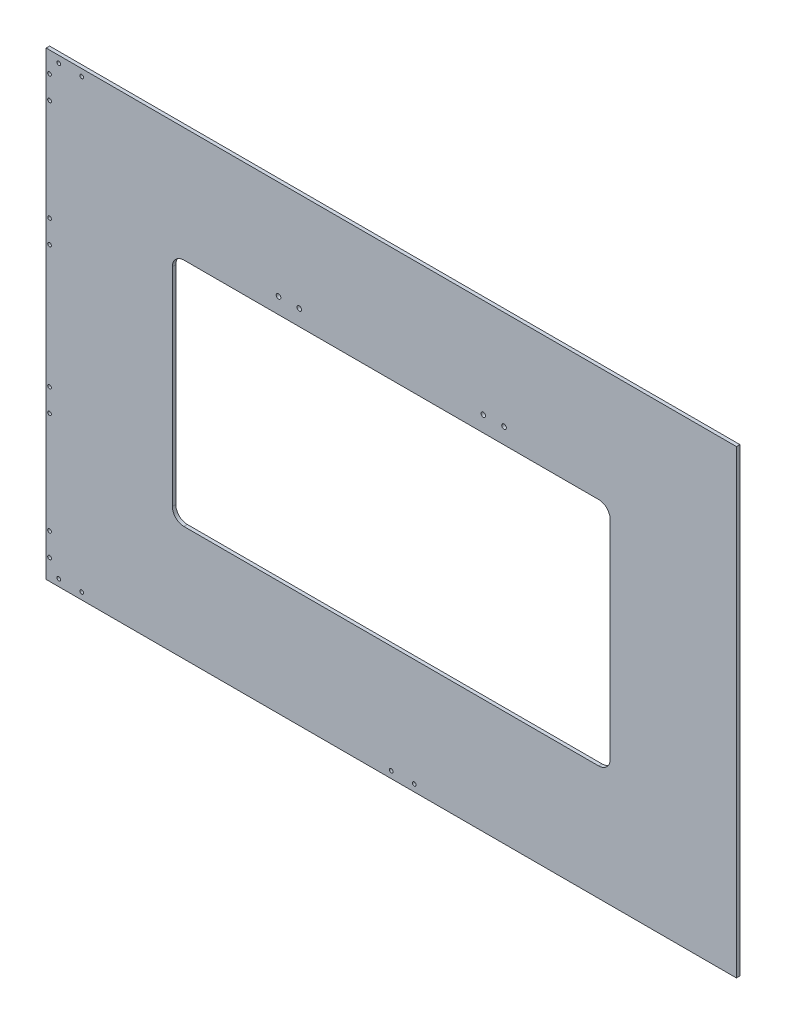
ISO-10303-21;
HEADER;
FILE_DESCRIPTION(('STEP AP214'),'2;1');
FILE_NAME('part.step','',(''),(''),'','','');
FILE_SCHEMA(('AUTOMOTIVE_DESIGN { 1 0 10303 214 1 1 1 1 }'));
ENDSEC;
DATA;
#1=APPLICATION_CONTEXT('core data for automotive mechanical design processes');
#2=APPLICATION_PROTOCOL_DEFINITION('international standard','automotive_design',2000,#1);
#3=PRODUCT_CONTEXT('',#1,'mechanical');
#4=PRODUCT('Part','Part','',(#3));
#5=PRODUCT_RELATED_PRODUCT_CATEGORY('part','',(#4));
#6=PRODUCT_DEFINITION_FORMATION('','',#4);
#7=PRODUCT_DEFINITION_CONTEXT('part definition',#1,'design');
#8=PRODUCT_DEFINITION('design','',#6,#7);
#9=PRODUCT_DEFINITION_SHAPE('','',#8);
#10=(LENGTH_UNIT() NAMED_UNIT(*) SI_UNIT(.MILLI.,.METRE.));
#11=(NAMED_UNIT(*) PLANE_ANGLE_UNIT() SI_UNIT($,.RADIAN.));
#12=(NAMED_UNIT(*) SI_UNIT($,.STERADIAN.) SOLID_ANGLE_UNIT());
#13=UNCERTAINTY_MEASURE_WITH_UNIT(LENGTH_MEASURE(1.E-05),#10,'distance_accuracy_value','');
#14=(GEOMETRIC_REPRESENTATION_CONTEXT(3) GLOBAL_UNCERTAINTY_ASSIGNED_CONTEXT((#13)) GLOBAL_UNIT_ASSIGNED_CONTEXT((#10,
#11,#12)) REPRESENTATION_CONTEXT('',''));
#15=CARTESIAN_POINT('',(0.,0.,0.));
#16=DIRECTION('',(0.,0.,1.));
#17=DIRECTION('',(1.,0.,0.));
#18=AXIS2_PLACEMENT_3D('',#15,#16,#17);
#19=CARTESIAN_POINT('',(300.,200.,3.));
#20=DIRECTION('',(-1.,0.,0.));
#21=DIRECTION('',(0.,0.,1.));
#22=AXIS2_PLACEMENT_3D('',#19,#20,#21);
#23=PLANE('',#22);
#24=DIRECTION('',(0.,1.,0.));
#25=VECTOR('',#24,1.);
#26=CARTESIAN_POINT('',(300.,200.,0.));
#27=LINE('',#26,#25);
#28=CARTESIAN_POINT('',(300.,-200.,0.));
#29=VERTEX_POINT('',#28);
#30=CARTESIAN_POINT('',(300.,200.,0.));
#31=VERTEX_POINT('',#30);
#32=EDGE_CURVE('E152',#29,#31,#27,.T.);
#33=ORIENTED_EDGE('',*,*,#32,.T.);
#34=DIRECTION('',(0.,0.,-1.));
#35=VECTOR('',#34,1.);
#36=CARTESIAN_POINT('',(300.,200.,3.));
#37=LINE('',#36,#35);
#38=CARTESIAN_POINT('',(300.,200.,3.));
#39=VERTEX_POINT('',#38);
#40=EDGE_CURVE('E134',#39,#31,#37,.T.);
#41=ORIENTED_EDGE('',*,*,#40,.F.);
#42=DIRECTION('',(0.,1.,0.));
#43=VECTOR('',#42,1.);
#44=CARTESIAN_POINT('',(300.,200.,3.));
#45=LINE('',#44,#43);
#46=CARTESIAN_POINT('',(300.,-200.,3.));
#47=VERTEX_POINT('',#46);
#48=EDGE_CURVE('E145',#47,#39,#45,.T.);
#49=ORIENTED_EDGE('',*,*,#48,.F.);
#50=DIRECTION('',(0.,0.,-1.));
#51=VECTOR('',#50,1.);
#52=CARTESIAN_POINT('',(300.,-200.,3.));
#53=LINE('',#52,#51);
#54=EDGE_CURVE('E293',#47,#29,#53,.T.);
#55=ORIENTED_EDGE('',*,*,#54,.T.);
#56=EDGE_LOOP('',(#33,#41,#49,#55));
#57=FACE_BOUND('',#56,.T.);
#58=ADVANCED_FACE('F41',(#57),#23,.F.);
#59=CARTESIAN_POINT('',(-300.,200.,3.));
#60=DIRECTION('',(0.,-1.,0.));
#61=DIRECTION('',(0.,0.,-1.));
#62=AXIS2_PLACEMENT_3D('',#59,#60,#61);
#63=PLANE('',#62);
#64=DIRECTION('',(-1.,0.,0.));
#65=VECTOR('',#64,1.);
#66=CARTESIAN_POINT('',(-300.,200.,0.));
#67=LINE('',#66,#65);
#68=CARTESIAN_POINT('',(-300.,200.,0.));
#69=VERTEX_POINT('',#68);
#70=EDGE_CURVE('E291',#31,#69,#67,.T.);
#71=ORIENTED_EDGE('',*,*,#70,.T.);
#72=DIRECTION('',(0.,0.,-1.));
#73=VECTOR('',#72,1.);
#74=CARTESIAN_POINT('',(-300.,200.,3.));
#75=LINE('',#74,#73);
#76=CARTESIAN_POINT('',(-300.,200.,3.));
#77=VERTEX_POINT('',#76);
#78=EDGE_CURVE('E139',#77,#69,#75,.T.);
#79=ORIENTED_EDGE('',*,*,#78,.F.);
#80=DIRECTION('',(-1.,0.,0.));
#81=VECTOR('',#80,1.);
#82=CARTESIAN_POINT('',(-300.,200.,3.));
#83=LINE('',#82,#81);
#84=EDGE_CURVE('E131',#39,#77,#83,.T.);
#85=ORIENTED_EDGE('',*,*,#84,.F.);
#86=ORIENTED_EDGE('',*,*,#40,.T.);
#87=EDGE_LOOP('',(#71,#79,#85,#86));
#88=FACE_BOUND('',#87,.T.);
#89=ADVANCED_FACE('F133',(#88),#63,.F.);
#90=CARTESIAN_POINT('',(-300.,200.,3.));
#91=DIRECTION('',(1.,0.,0.));
#92=DIRECTION('',(0.,0.,-1.));
#93=AXIS2_PLACEMENT_3D('',#90,#91,#92);
#94=PLANE('',#93);
#95=DIRECTION('',(0.,-1.,0.));
#96=VECTOR('',#95,1.);
#97=CARTESIAN_POINT('',(-300.,200.,0.));
#98=LINE('',#97,#96);
#99=CARTESIAN_POINT('',(-300.,-200.,0.));
#100=VERTEX_POINT('',#99);
#101=EDGE_CURVE('E294',#69,#100,#98,.T.);
#102=ORIENTED_EDGE('',*,*,#101,.T.);
#103=DIRECTION('',(0.,0.,-1.));
#104=VECTOR('',#103,1.);
#105=CARTESIAN_POINT('',(-300.,-200.,3.));
#106=LINE('',#105,#104);
#107=CARTESIAN_POINT('',(-300.,-200.,3.));
#108=VERTEX_POINT('',#107);
#109=EDGE_CURVE('E156',#108,#100,#106,.T.);
#110=ORIENTED_EDGE('',*,*,#109,.F.);
#111=DIRECTION('',(0.,-1.,0.));
#112=VECTOR('',#111,1.);
#113=CARTESIAN_POINT('',(-300.,200.,3.));
#114=LINE('',#113,#112);
#115=EDGE_CURVE('E142',#77,#108,#114,.T.);
#116=ORIENTED_EDGE('',*,*,#115,.F.);
#117=ORIENTED_EDGE('',*,*,#78,.T.);
#118=EDGE_LOOP('',(#102,#110,#116,#117));
#119=FACE_BOUND('',#118,.T.);
#120=ADVANCED_FACE('F306',(#119),#94,.F.);
#121=CARTESIAN_POINT('',(-300.,-200.,3.));
#122=DIRECTION('',(0.,1.,0.));
#123=DIRECTION('',(0.,0.,1.));
#124=AXIS2_PLACEMENT_3D('',#121,#122,#123);
#125=PLANE('',#124);
#126=DIRECTION('',(1.,0.,0.));
#127=VECTOR('',#126,1.);
#128=CARTESIAN_POINT('',(-300.,-200.,0.));
#129=LINE('',#128,#127);
#130=EDGE_CURVE('E151',#100,#29,#129,.T.);
#131=ORIENTED_EDGE('',*,*,#130,.T.);
#132=ORIENTED_EDGE('',*,*,#54,.F.);
#133=DIRECTION('',(1.,0.,0.));
#134=VECTOR('',#133,1.);
#135=CARTESIAN_POINT('',(-300.,-200.,3.));
#136=LINE('',#135,#134);
#137=EDGE_CURVE('E150',#108,#47,#136,.T.);
#138=ORIENTED_EDGE('',*,*,#137,.F.);
#139=ORIENTED_EDGE('',*,*,#109,.T.);
#140=EDGE_LOOP('',(#131,#132,#138,#139));
#141=FACE_BOUND('',#140,.T.);
#142=ADVANCED_FACE('F305',(#141),#125,.F.);
#143=CARTESIAN_POINT('',(0.,0.,3.));
#144=DIRECTION('',(0.,0.,1.));
#145=DIRECTION('',(1.,0.,0.));
#146=AXIS2_PLACEMENT_3D('',#143,#144,#145);
#147=PLANE('',#146);
#148=CARTESIAN_POINT('',(-98.0000000000002,114.,3.));
#149=DIRECTION('',(0.,0.,1.));
#150=DIRECTION('',(1.,0.,0.));
#151=AXIS2_PLACEMENT_3D('',#148,#149,#150);
#152=CIRCLE('',#151,1.99999999999998);
#153=CARTESIAN_POINT('',(-96.0000000000002,114.,3.));
#154=VERTEX_POINT('',#153);
#155=EDGE_CURVE('E441',#154,#154,#152,.T.);
#156=ORIENTED_EDGE('',*,*,#155,.F.);
#157=EDGE_LOOP('',(#156));
#158=FACE_BOUND('',#157,.T.);
#159=CARTESIAN_POINT('',(-80.0000000000002,114.,3.));
#160=DIRECTION('',(0.,0.,1.));
#161=DIRECTION('',(1.,0.,0.));
#162=AXIS2_PLACEMENT_3D('',#159,#160,#161);
#163=CIRCLE('',#162,2.00000000000001);
#164=CARTESIAN_POINT('',(-78.0000000000002,114.,3.));
#165=VERTEX_POINT('',#164);
#166=EDGE_CURVE('E463',#165,#165,#163,.T.);
#167=ORIENTED_EDGE('',*,*,#166,.F.);
#168=EDGE_LOOP('',(#167));
#169=FACE_BOUND('',#168,.T.);
#170=CARTESIAN_POINT('',(80.0000000000002,114.,3.));
#171=DIRECTION('',(0.,0.,1.));
#172=DIRECTION('',(-1.,0.,0.));
#173=AXIS2_PLACEMENT_3D('',#170,#171,#172);
#174=CIRCLE('',#173,2.00000000000001);
#175=CARTESIAN_POINT('',(78.0000000000002,114.,3.));
#176=VERTEX_POINT('',#175);
#177=EDGE_CURVE('E462',#176,#176,#174,.T.);
#178=ORIENTED_EDGE('',*,*,#177,.F.);
#179=EDGE_LOOP('',(#178));
#180=FACE_BOUND('',#179,.T.);
#181=CARTESIAN_POINT('',(98.0000000000002,114.,3.));
#182=DIRECTION('',(0.,0.,1.));
#183=DIRECTION('',(-1.,0.,0.));
#184=AXIS2_PLACEMENT_3D('',#181,#182,#183);
#185=CIRCLE('',#184,1.99999999999998);
#186=CARTESIAN_POINT('',(96.0000000000002,114.,3.));
#187=VERTEX_POINT('',#186);
#188=EDGE_CURVE('E460',#187,#187,#185,.T.);
#189=ORIENTED_EDGE('',*,*,#188,.F.);
#190=EDGE_LOOP('',(#189));
#191=FACE_BOUND('',#190,.T.);
#192=CARTESIAN_POINT('',(-297.,73.5000000000003,3.));
#193=DIRECTION('',(0.,0.,1.));
#194=DIRECTION('',(1.,0.,0.));
#195=AXIS2_PLACEMENT_3D('',#192,#193,#194);
#196=CIRCLE('',#195,1.57500000000017);
#197=CARTESIAN_POINT('',(-295.425,73.5000000000003,3.));
#198=VERTEX_POINT('',#197);
#199=EDGE_CURVE('E455',#198,#198,#196,.T.);
#200=ORIENTED_EDGE('',*,*,#199,.F.);
#201=EDGE_LOOP('',(#200));
#202=FACE_BOUND('',#201,.T.);
#203=CARTESIAN_POINT('',(-297.,53.5000000000003,3.));
#204=DIRECTION('',(0.,0.,1.));
#205=DIRECTION('',(1.,0.,0.));
#206=AXIS2_PLACEMENT_3D('',#203,#204,#205);
#207=CIRCLE('',#206,1.57500000000017);
#208=CARTESIAN_POINT('',(-295.425,53.5000000000003,3.));
#209=VERTEX_POINT('',#208);
#210=EDGE_CURVE('E446',#209,#209,#207,.T.);
#211=ORIENTED_EDGE('',*,*,#210,.F.);
#212=EDGE_LOOP('',(#211));
#213=FACE_BOUND('',#212,.T.);
#214=CARTESIAN_POINT('',(-297.,-53.5000000000005,3.));
#215=DIRECTION('',(0.,0.,1.));
#216=DIRECTION('',(1.,0.,0.));
#217=AXIS2_PLACEMENT_3D('',#214,#215,#216);
#218=CIRCLE('',#217,1.5750000000006);
#219=CARTESIAN_POINT('',(-295.424999999999,-53.5000000000005,3.));
#220=VERTEX_POINT('',#219);
#221=EDGE_CURVE('E444',#220,#220,#218,.T.);
#222=ORIENTED_EDGE('',*,*,#221,.F.);
#223=EDGE_LOOP('',(#222));
#224=FACE_BOUND('',#223,.T.);
#225=CARTESIAN_POINT('',(-297.,-73.5000000000006,3.));
#226=DIRECTION('',(0.,0.,1.));
#227=DIRECTION('',(1.,0.,0.));
#228=AXIS2_PLACEMENT_3D('',#225,#226,#227);
#229=CIRCLE('',#228,1.5750000000006);
#230=CARTESIAN_POINT('',(-295.424999999999,-73.5000000000006,3.));
#231=VERTEX_POINT('',#230);
#232=EDGE_CURVE('E438',#231,#231,#229,.T.);
#233=ORIENTED_EDGE('',*,*,#232,.F.);
#234=EDGE_LOOP('',(#233));
#235=FACE_BOUND('',#234,.T.);
#236=DIRECTION('',(0.,1.,0.));
#237=VECTOR('',#236,1.);
#238=CARTESIAN_POINT('',(190.25,100.25,3.));
#239=LINE('',#238,#237);
#240=CARTESIAN_POINT('',(190.25,-90.2499999999999,3.));
#241=VERTEX_POINT('',#240);
#242=CARTESIAN_POINT('',(190.25,90.25,3.));
#243=VERTEX_POINT('',#242);
#244=EDGE_CURVE('E192',#241,#243,#239,.T.);
#245=ORIENTED_EDGE('',*,*,#244,.F.);
#246=CARTESIAN_POINT('',(180.25,-90.25,3.));
#247=DIRECTION('',(0.,0.,1.));
#248=DIRECTION('',(1.,0.,0.));
#249=AXIS2_PLACEMENT_3D('',#246,#247,#248);
#250=CIRCLE('',#249,10.);
#251=CARTESIAN_POINT('',(180.25,-100.25,3.));
#252=VERTEX_POINT('',#251);
#253=EDGE_CURVE('E190',#241,#252,#250,.F.);
#254=ORIENTED_EDGE('',*,*,#253,.T.);
#255=DIRECTION('',(1.,0.,0.));
#256=VECTOR('',#255,1.);
#257=CARTESIAN_POINT('',(-190.25,-100.25,3.));
#258=LINE('',#257,#256);
#259=CARTESIAN_POINT('',(-180.25,-100.25,3.));
#260=VERTEX_POINT('',#259);
#261=EDGE_CURVE('E218',#260,#252,#258,.T.);
#262=ORIENTED_EDGE('',*,*,#261,.F.);
#263=CARTESIAN_POINT('',(-180.25,-90.25,3.));
#264=DIRECTION('',(0.,0.,1.));
#265=DIRECTION('',(1.,0.,0.));
#266=AXIS2_PLACEMENT_3D('',#263,#264,#265);
#267=CIRCLE('',#266,10.);
#268=CARTESIAN_POINT('',(-190.25,-90.2499999999999,3.));
#269=VERTEX_POINT('',#268);
#270=EDGE_CURVE('E177',#260,#269,#267,.F.);
#271=ORIENTED_EDGE('',*,*,#270,.T.);
#272=DIRECTION('',(0.,-1.,0.));
#273=VECTOR('',#272,1.);
#274=CARTESIAN_POINT('',(-190.25,100.25,3.));
#275=LINE('',#274,#273);
#276=CARTESIAN_POINT('',(-190.25,90.25,3.));
#277=VERTEX_POINT('',#276);
#278=EDGE_CURVE('E223',#277,#269,#275,.T.);
#279=ORIENTED_EDGE('',*,*,#278,.F.);
#280=CARTESIAN_POINT('',(-180.25,90.25,3.));
#281=DIRECTION('',(0.,0.,1.));
#282=DIRECTION('',(1.,0.,0.));
#283=AXIS2_PLACEMENT_3D('',#280,#281,#282);
#284=CIRCLE('',#283,10.);
#285=CARTESIAN_POINT('',(-180.25,100.25,3.));
#286=VERTEX_POINT('',#285);
#287=EDGE_CURVE('E182',#277,#286,#284,.F.);
#288=ORIENTED_EDGE('',*,*,#287,.T.);
#289=DIRECTION('',(-1.,0.,0.));
#290=VECTOR('',#289,1.);
#291=CARTESIAN_POINT('',(-190.25,100.25,3.));
#292=LINE('',#291,#290);
#293=CARTESIAN_POINT('',(180.25,100.25,3.));
#294=VERTEX_POINT('',#293);
#295=EDGE_CURVE('E194',#294,#286,#292,.T.);
#296=ORIENTED_EDGE('',*,*,#295,.F.);
#297=CARTESIAN_POINT('',(180.25,90.25,3.));
#298=DIRECTION('',(0.,0.,1.));
#299=DIRECTION('',(1.,0.,0.));
#300=AXIS2_PLACEMENT_3D('',#297,#298,#299);
#301=CIRCLE('',#300,10.);
#302=EDGE_CURVE('E47',#294,#243,#301,.F.);
#303=ORIENTED_EDGE('',*,*,#302,.T.);
#304=EDGE_LOOP('',(#245,#254,#262,#271,#279,#288,#296,#303));
#305=FACE_BOUND('',#304,.T.);
#306=CARTESIAN_POINT('',(0.,-194.,3.));
#307=DIRECTION('',(0.,0.,-1.));
#308=DIRECTION('',(-1.,0.,0.));
#309=AXIS2_PLACEMENT_3D('',#306,#307,#308);
#310=CIRCLE('',#309,1.59999999999999);
#311=CARTESIAN_POINT('',(-1.59999999999996,-194.,3.));
#312=VERTEX_POINT('',#311);
#313=EDGE_CURVE('E229',#312,#312,#310,.T.);
#314=ORIENTED_EDGE('',*,*,#313,.T.);
#315=EDGE_LOOP('',(#314));
#316=FACE_BOUND('',#315,.T.);
#317=CARTESIAN_POINT('',(20.,-194.,3.));
#318=DIRECTION('',(0.,0.,-1.));
#319=DIRECTION('',(-1.,0.,0.));
#320=AXIS2_PLACEMENT_3D('',#317,#318,#319);
#321=CIRCLE('',#320,1.59999999999999);
#322=CARTESIAN_POINT('',(18.4,-194.,3.));
#323=VERTEX_POINT('',#322);
#324=EDGE_CURVE('E225',#323,#323,#321,.T.);
#325=ORIENTED_EDGE('',*,*,#324,.T.);
#326=EDGE_LOOP('',(#325));
#327=FACE_BOUND('',#326,.T.);
#328=CARTESIAN_POINT('',(-297.,-162.,3.));
#329=DIRECTION('',(0.,0.,1.));
#330=DIRECTION('',(1.,0.,0.));
#331=AXIS2_PLACEMENT_3D('',#328,#329,#330);
#332=CIRCLE('',#331,1.59999999999996);
#333=CARTESIAN_POINT('',(-295.4,-162.,3.));
#334=VERTEX_POINT('',#333);
#335=EDGE_CURVE('E246',#334,#334,#332,.T.);
#336=ORIENTED_EDGE('',*,*,#335,.F.);
#337=EDGE_LOOP('',(#336));
#338=FACE_BOUND('',#337,.T.);
#339=CARTESIAN_POINT('',(-297.,-182.,3.));
#340=DIRECTION('',(0.,0.,1.));
#341=DIRECTION('',(1.,0.,0.));
#342=AXIS2_PLACEMENT_3D('',#339,#340,#341);
#343=CIRCLE('',#342,1.59999999999996);
#344=CARTESIAN_POINT('',(-295.4,-182.,3.));
#345=VERTEX_POINT('',#344);
#346=EDGE_CURVE('E248',#345,#345,#343,.T.);
#347=ORIENTED_EDGE('',*,*,#346,.F.);
#348=EDGE_LOOP('',(#347));
#349=FACE_BOUND('',#348,.T.);
#350=CARTESIAN_POINT('',(-289.,-194.,3.));
#351=DIRECTION('',(0.,0.,1.));
#352=DIRECTION('',(1.,0.,0.));
#353=AXIS2_PLACEMENT_3D('',#350,#351,#352);
#354=CIRCLE('',#353,1.59999999999996);
#355=CARTESIAN_POINT('',(-287.4,-194.,3.));
#356=VERTEX_POINT('',#355);
#357=EDGE_CURVE('E253',#356,#356,#354,.T.);
#358=ORIENTED_EDGE('',*,*,#357,.F.);
#359=EDGE_LOOP('',(#358));
#360=FACE_BOUND('',#359,.T.);
#361=CARTESIAN_POINT('',(-269.,-194.,3.));
#362=DIRECTION('',(0.,0.,1.));
#363=DIRECTION('',(1.,0.,0.));
#364=AXIS2_PLACEMENT_3D('',#361,#362,#363);
#365=CIRCLE('',#364,1.59999999999996);
#366=CARTESIAN_POINT('',(-267.4,-194.,3.));
#367=VERTEX_POINT('',#366);
#368=EDGE_CURVE('E261',#367,#367,#365,.T.);
#369=ORIENTED_EDGE('',*,*,#368,.F.);
#370=EDGE_LOOP('',(#369));
#371=FACE_BOUND('',#370,.T.);
#372=CARTESIAN_POINT('',(-297.,162.000000000001,3.));
#373=DIRECTION('',(0.,0.,1.));
#374=DIRECTION('',(1.,0.,0.));
#375=AXIS2_PLACEMENT_3D('',#372,#373,#374);
#376=CIRCLE('',#375,1.59999999999996);
#377=CARTESIAN_POINT('',(-295.4,162.000000000001,3.));
#378=VERTEX_POINT('',#377);
#379=EDGE_CURVE('E266',#378,#378,#376,.T.);
#380=ORIENTED_EDGE('',*,*,#379,.F.);
#381=EDGE_LOOP('',(#380));
#382=FACE_BOUND('',#381,.T.);
#383=CARTESIAN_POINT('',(-297.,182.000000000001,3.));
#384=DIRECTION('',(0.,0.,1.));
#385=DIRECTION('',(1.,0.,0.));
#386=AXIS2_PLACEMENT_3D('',#383,#384,#385);
#387=CIRCLE('',#386,1.59999999999996);
#388=CARTESIAN_POINT('',(-295.4,182.000000000001,3.));
#389=VERTEX_POINT('',#388);
#390=EDGE_CURVE('E275',#389,#389,#387,.T.);
#391=ORIENTED_EDGE('',*,*,#390,.F.);
#392=EDGE_LOOP('',(#391));
#393=FACE_BOUND('',#392,.T.);
#394=CARTESIAN_POINT('',(-289.,194.000000000001,3.));
#395=DIRECTION('',(0.,0.,1.));
#396=DIRECTION('',(1.,0.,0.));
#397=AXIS2_PLACEMENT_3D('',#394,#395,#396);
#398=CIRCLE('',#397,1.59999999999996);
#399=CARTESIAN_POINT('',(-287.4,194.000000000001,3.));
#400=VERTEX_POINT('',#399);
#401=EDGE_CURVE('E277',#400,#400,#398,.T.);
#402=ORIENTED_EDGE('',*,*,#401,.F.);
#403=EDGE_LOOP('',(#402));
#404=FACE_BOUND('',#403,.T.);
#405=CARTESIAN_POINT('',(-269.,194.000000000001,3.));
#406=DIRECTION('',(0.,0.,1.));
#407=DIRECTION('',(1.,0.,0.));
#408=AXIS2_PLACEMENT_3D('',#405,#406,#407);
#409=CIRCLE('',#408,1.59999999999996);
#410=CARTESIAN_POINT('',(-267.4,194.000000000001,3.));
#411=VERTEX_POINT('',#410);
#412=EDGE_CURVE('E282',#411,#411,#409,.T.);
#413=ORIENTED_EDGE('',*,*,#412,.F.);
#414=EDGE_LOOP('',(#413));
#415=FACE_BOUND('',#414,.T.);
#416=ORIENTED_EDGE('',*,*,#48,.T.);
#417=ORIENTED_EDGE('',*,*,#84,.T.);
#418=ORIENTED_EDGE('',*,*,#115,.T.);
#419=ORIENTED_EDGE('',*,*,#137,.T.);
#420=EDGE_LOOP('',(#416,#417,#418,#419));
#421=FACE_BOUND('',#420,.T.);
#422=ADVANCED_FACE('F143',(#158,#169,#180,#191,#202,#213,#224,#235,#305,#316,#327,#338,#349,
#360,#371,#382,#393,#404,#415,#421),#147,.T.);
#423=CARTESIAN_POINT('',(0.,0.,0.));
#424=DIRECTION('',(0.,0.,1.));
#425=DIRECTION('',(1.,0.,0.));
#426=AXIS2_PLACEMENT_3D('',#423,#424,#425);
#427=PLANE('',#426);
#428=CARTESIAN_POINT('',(-98.0000000000002,114.,0.));
#429=DIRECTION('',(0.,0.,1.));
#430=DIRECTION('',(1.,0.,0.));
#431=AXIS2_PLACEMENT_3D('',#428,#429,#430);
#432=CIRCLE('',#431,1.99999999999998);
#433=CARTESIAN_POINT('',(-96.0000000000002,114.,0.));
#434=VERTEX_POINT('',#433);
#435=EDGE_CURVE('E409',#434,#434,#432,.T.);
#436=ORIENTED_EDGE('',*,*,#435,.T.);
#437=EDGE_LOOP('',(#436));
#438=FACE_BOUND('',#437,.T.);
#439=CARTESIAN_POINT('',(-80.0000000000002,114.,0.));
#440=DIRECTION('',(0.,0.,1.));
#441=DIRECTION('',(1.,0.,0.));
#442=AXIS2_PLACEMENT_3D('',#439,#440,#441);
#443=CIRCLE('',#442,2.00000000000001);
#444=CARTESIAN_POINT('',(-78.0000000000002,114.,0.));
#445=VERTEX_POINT('',#444);
#446=EDGE_CURVE('E412',#445,#445,#443,.T.);
#447=ORIENTED_EDGE('',*,*,#446,.T.);
#448=EDGE_LOOP('',(#447));
#449=FACE_BOUND('',#448,.T.);
#450=CARTESIAN_POINT('',(80.0000000000002,114.,0.));
#451=DIRECTION('',(0.,0.,1.));
#452=DIRECTION('',(-1.,0.,0.));
#453=AXIS2_PLACEMENT_3D('',#450,#451,#452);
#454=CIRCLE('',#453,2.00000000000001);
#455=CARTESIAN_POINT('',(78.0000000000002,114.,0.));
#456=VERTEX_POINT('',#455);
#457=EDGE_CURVE('E419',#456,#456,#454,.T.);
#458=ORIENTED_EDGE('',*,*,#457,.T.);
#459=EDGE_LOOP('',(#458));
#460=FACE_BOUND('',#459,.T.);
#461=CARTESIAN_POINT('',(98.0000000000002,114.,0.));
#462=DIRECTION('',(0.,0.,1.));
#463=DIRECTION('',(-1.,0.,0.));
#464=AXIS2_PLACEMENT_3D('',#461,#462,#463);
#465=CIRCLE('',#464,1.99999999999998);
#466=CARTESIAN_POINT('',(96.0000000000002,114.,0.));
#467=VERTEX_POINT('',#466);
#468=EDGE_CURVE('E422',#467,#467,#465,.T.);
#469=ORIENTED_EDGE('',*,*,#468,.T.);
#470=EDGE_LOOP('',(#469));
#471=FACE_BOUND('',#470,.T.);
#472=CARTESIAN_POINT('',(-297.,73.5000000000003,0.));
#473=DIRECTION('',(0.,0.,1.));
#474=DIRECTION('',(1.,0.,0.));
#475=AXIS2_PLACEMENT_3D('',#472,#473,#474);
#476=CIRCLE('',#475,1.57500000000017);
#477=CARTESIAN_POINT('',(-295.425,73.5000000000003,0.));
#478=VERTEX_POINT('',#477);
#479=EDGE_CURVE('E199',#478,#478,#476,.T.);
#480=ORIENTED_EDGE('',*,*,#479,.T.);
#481=EDGE_LOOP('',(#480));
#482=FACE_BOUND('',#481,.T.);
#483=CARTESIAN_POINT('',(-297.,53.5000000000003,0.));
#484=DIRECTION('',(0.,0.,1.));
#485=DIRECTION('',(1.,0.,0.));
#486=AXIS2_PLACEMENT_3D('',#483,#484,#485);
#487=CIRCLE('',#486,1.57500000000017);
#488=CARTESIAN_POINT('',(-295.425,53.5000000000003,0.));
#489=VERTEX_POINT('',#488);
#490=EDGE_CURVE('E429',#489,#489,#487,.T.);
#491=ORIENTED_EDGE('',*,*,#490,.T.);
#492=EDGE_LOOP('',(#491));
#493=FACE_BOUND('',#492,.T.);
#494=CARTESIAN_POINT('',(-297.,-53.5000000000005,0.));
#495=DIRECTION('',(0.,0.,1.));
#496=DIRECTION('',(1.,0.,0.));
#497=AXIS2_PLACEMENT_3D('',#494,#495,#496);
#498=CIRCLE('',#497,1.5750000000006);
#499=CARTESIAN_POINT('',(-295.424999999999,-53.5000000000005,0.));
#500=VERTEX_POINT('',#499);
#501=EDGE_CURVE('E433',#500,#500,#498,.T.);
#502=ORIENTED_EDGE('',*,*,#501,.T.);
#503=EDGE_LOOP('',(#502));
#504=FACE_BOUND('',#503,.T.);
#505=CARTESIAN_POINT('',(-297.,-73.5000000000006,0.));
#506=DIRECTION('',(0.,0.,1.));
#507=DIRECTION('',(1.,0.,0.));
#508=AXIS2_PLACEMENT_3D('',#505,#506,#507);
#509=CIRCLE('',#508,1.5750000000006);
#510=CARTESIAN_POINT('',(-295.424999999999,-73.5000000000006,0.));
#511=VERTEX_POINT('',#510);
#512=EDGE_CURVE('E436',#511,#511,#509,.T.);
#513=ORIENTED_EDGE('',*,*,#512,.T.);
#514=EDGE_LOOP('',(#513));
#515=FACE_BOUND('',#514,.T.);
#516=DIRECTION('',(0.,-1.,0.));
#517=VECTOR('',#516,1.);
#518=CARTESIAN_POINT('',(-190.25,100.25,0.));
#519=LINE('',#518,#517);
#520=CARTESIAN_POINT('',(-190.25,90.25,0.));
#521=VERTEX_POINT('',#520);
#522=CARTESIAN_POINT('',(-190.25,-90.2499999999999,0.));
#523=VERTEX_POINT('',#522);
#524=EDGE_CURVE('E213',#521,#523,#519,.T.);
#525=ORIENTED_EDGE('',*,*,#524,.T.);
#526=CARTESIAN_POINT('',(-180.25,-90.25,0.));
#527=DIRECTION('',(0.,0.,1.));
#528=DIRECTION('',(1.,0.,0.));
#529=AXIS2_PLACEMENT_3D('',#526,#527,#528);
#530=CIRCLE('',#529,10.);
#531=CARTESIAN_POINT('',(-180.25,-100.25,0.));
#532=VERTEX_POINT('',#531);
#533=EDGE_CURVE('E181',#523,#532,#530,.T.);
#534=ORIENTED_EDGE('',*,*,#533,.T.);
#535=DIRECTION('',(1.,0.,0.));
#536=VECTOR('',#535,1.);
#537=CARTESIAN_POINT('',(-190.25,-100.25,0.));
#538=LINE('',#537,#536);
#539=CARTESIAN_POINT('',(180.25,-100.25,0.));
#540=VERTEX_POINT('',#539);
#541=EDGE_CURVE('E216',#532,#540,#538,.T.);
#542=ORIENTED_EDGE('',*,*,#541,.T.);
#543=CARTESIAN_POINT('',(180.25,-90.25,0.));
#544=DIRECTION('',(0.,0.,1.));
#545=DIRECTION('',(1.,0.,0.));
#546=AXIS2_PLACEMENT_3D('',#543,#544,#545);
#547=CIRCLE('',#546,10.);
#548=CARTESIAN_POINT('',(190.25,-90.2499999999999,0.));
#549=VERTEX_POINT('',#548);
#550=EDGE_CURVE('E62',#540,#549,#547,.T.);
#551=ORIENTED_EDGE('',*,*,#550,.T.);
#552=DIRECTION('',(0.,1.,0.));
#553=VECTOR('',#552,1.);
#554=CARTESIAN_POINT('',(190.25,100.25,0.));
#555=LINE('',#554,#553);
#556=CARTESIAN_POINT('',(190.25,90.25,0.));
#557=VERTEX_POINT('',#556);
#558=EDGE_CURVE('E208',#549,#557,#555,.T.);
#559=ORIENTED_EDGE('',*,*,#558,.T.);
#560=CARTESIAN_POINT('',(180.25,90.25,0.));
#561=DIRECTION('',(0.,0.,1.));
#562=DIRECTION('',(1.,0.,0.));
#563=AXIS2_PLACEMENT_3D('',#560,#561,#562);
#564=CIRCLE('',#563,10.);
#565=CARTESIAN_POINT('',(180.25,100.25,0.));
#566=VERTEX_POINT('',#565);
#567=EDGE_CURVE('E11',#557,#566,#564,.T.);
#568=ORIENTED_EDGE('',*,*,#567,.T.);
#569=DIRECTION('',(-1.,0.,0.));
#570=VECTOR('',#569,1.);
#571=CARTESIAN_POINT('',(-190.25,100.25,0.));
#572=LINE('',#571,#570);
#573=CARTESIAN_POINT('',(-180.25,100.25,0.));
#574=VERTEX_POINT('',#573);
#575=EDGE_CURVE('E206',#566,#574,#572,.T.);
#576=ORIENTED_EDGE('',*,*,#575,.T.);
#577=CARTESIAN_POINT('',(-180.25,90.25,0.));
#578=DIRECTION('',(0.,0.,1.));
#579=DIRECTION('',(1.,0.,0.));
#580=AXIS2_PLACEMENT_3D('',#577,#578,#579);
#581=CIRCLE('',#580,10.);
#582=EDGE_CURVE('E184',#574,#521,#581,.T.);
#583=ORIENTED_EDGE('',*,*,#582,.T.);
#584=EDGE_LOOP('',(#525,#534,#542,#551,#559,#568,#576,#583));
#585=FACE_BOUND('',#584,.T.);
#586=CARTESIAN_POINT('',(0.,-194.,0.));
#587=DIRECTION('',(0.,0.,-1.));
#588=DIRECTION('',(-1.,0.,0.));
#589=AXIS2_PLACEMENT_3D('',#586,#587,#588);
#590=CIRCLE('',#589,1.59999999999999);
#591=CARTESIAN_POINT('',(-1.59999999999996,-194.,0.));
#592=VERTEX_POINT('',#591);
#593=EDGE_CURVE('E234',#592,#592,#590,.T.);
#594=ORIENTED_EDGE('',*,*,#593,.F.);
#595=EDGE_LOOP('',(#594));
#596=FACE_BOUND('',#595,.T.);
#597=CARTESIAN_POINT('',(20.,-194.,0.));
#598=DIRECTION('',(0.,0.,-1.));
#599=DIRECTION('',(-1.,0.,0.));
#600=AXIS2_PLACEMENT_3D('',#597,#598,#599);
#601=CIRCLE('',#600,1.59999999999999);
#602=CARTESIAN_POINT('',(18.4,-194.,0.));
#603=VERTEX_POINT('',#602);
#604=EDGE_CURVE('E240',#603,#603,#601,.T.);
#605=ORIENTED_EDGE('',*,*,#604,.F.);
#606=EDGE_LOOP('',(#605));
#607=FACE_BOUND('',#606,.T.);
#608=CARTESIAN_POINT('',(-297.,-162.,0.));
#609=DIRECTION('',(0.,0.,1.));
#610=DIRECTION('',(1.,0.,0.));
#611=AXIS2_PLACEMENT_3D('',#608,#609,#610);
#612=CIRCLE('',#611,1.59999999999996);
#613=CARTESIAN_POINT('',(-295.4,-162.,0.));
#614=VERTEX_POINT('',#613);
#615=EDGE_CURVE('E245',#614,#614,#612,.T.);
#616=ORIENTED_EDGE('',*,*,#615,.T.);
#617=EDGE_LOOP('',(#616));
#618=FACE_BOUND('',#617,.T.);
#619=CARTESIAN_POINT('',(-297.,-182.,0.));
#620=DIRECTION('',(0.,0.,1.));
#621=DIRECTION('',(1.,0.,0.));
#622=AXIS2_PLACEMENT_3D('',#619,#620,#621);
#623=CIRCLE('',#622,1.59999999999996);
#624=CARTESIAN_POINT('',(-295.4,-182.,0.));
#625=VERTEX_POINT('',#624);
#626=EDGE_CURVE('E255',#625,#625,#623,.T.);
#627=ORIENTED_EDGE('',*,*,#626,.T.);
#628=EDGE_LOOP('',(#627));
#629=FACE_BOUND('',#628,.T.);
#630=CARTESIAN_POINT('',(-289.,-194.,0.));
#631=DIRECTION('',(0.,0.,1.));
#632=DIRECTION('',(1.,0.,0.));
#633=AXIS2_PLACEMENT_3D('',#630,#631,#632);
#634=CIRCLE('',#633,1.59999999999996);
#635=CARTESIAN_POINT('',(-287.4,-194.,0.));
#636=VERTEX_POINT('',#635);
#637=EDGE_CURVE('E257',#636,#636,#634,.T.);
#638=ORIENTED_EDGE('',*,*,#637,.T.);
#639=EDGE_LOOP('',(#638));
#640=FACE_BOUND('',#639,.T.);
#641=CARTESIAN_POINT('',(-269.,-194.,0.));
#642=DIRECTION('',(0.,0.,1.));
#643=DIRECTION('',(1.,0.,0.));
#644=AXIS2_PLACEMENT_3D('',#641,#642,#643);
#645=CIRCLE('',#644,1.59999999999996);
#646=CARTESIAN_POINT('',(-267.4,-194.,0.));
#647=VERTEX_POINT('',#646);
#648=EDGE_CURVE('E231',#647,#647,#645,.T.);
#649=ORIENTED_EDGE('',*,*,#648,.T.);
#650=EDGE_LOOP('',(#649));
#651=FACE_BOUND('',#650,.T.);
#652=CARTESIAN_POINT('',(-297.,162.000000000001,0.));
#653=DIRECTION('',(0.,0.,1.));
#654=DIRECTION('',(1.,0.,0.));
#655=AXIS2_PLACEMENT_3D('',#652,#653,#654);
#656=CIRCLE('',#655,1.59999999999996);
#657=CARTESIAN_POINT('',(-295.4,162.000000000001,0.));
#658=VERTEX_POINT('',#657);
#659=EDGE_CURVE('E267',#658,#658,#656,.T.);
#660=ORIENTED_EDGE('',*,*,#659,.T.);
#661=EDGE_LOOP('',(#660));
#662=FACE_BOUND('',#661,.T.);
#663=CARTESIAN_POINT('',(-297.,182.000000000001,0.));
#664=DIRECTION('',(0.,0.,1.));
#665=DIRECTION('',(1.,0.,0.));
#666=AXIS2_PLACEMENT_3D('',#663,#664,#665);
#667=CIRCLE('',#666,1.59999999999996);
#668=CARTESIAN_POINT('',(-295.4,182.000000000001,0.));
#669=VERTEX_POINT('',#668);
#670=EDGE_CURVE('E273',#669,#669,#667,.T.);
#671=ORIENTED_EDGE('',*,*,#670,.T.);
#672=EDGE_LOOP('',(#671));
#673=FACE_BOUND('',#672,.T.);
#674=CARTESIAN_POINT('',(-289.,194.000000000001,0.));
#675=DIRECTION('',(0.,0.,1.));
#676=DIRECTION('',(1.,0.,0.));
#677=AXIS2_PLACEMENT_3D('',#674,#675,#676);
#678=CIRCLE('',#677,1.59999999999996);
#679=CARTESIAN_POINT('',(-287.4,194.000000000001,0.));
#680=VERTEX_POINT('',#679);
#681=EDGE_CURVE('E281',#680,#680,#678,.T.);
#682=ORIENTED_EDGE('',*,*,#681,.T.);
#683=EDGE_LOOP('',(#682));
#684=FACE_BOUND('',#683,.T.);
#685=CARTESIAN_POINT('',(-269.,194.000000000001,0.));
#686=DIRECTION('',(0.,0.,1.));
#687=DIRECTION('',(1.,0.,0.));
#688=AXIS2_PLACEMENT_3D('',#685,#686,#687);
#689=CIRCLE('',#688,1.59999999999996);
#690=CARTESIAN_POINT('',(-267.4,194.000000000001,0.));
#691=VERTEX_POINT('',#690);
#692=EDGE_CURVE('E244',#691,#691,#689,.T.);
#693=ORIENTED_EDGE('',*,*,#692,.T.);
#694=EDGE_LOOP('',(#693));
#695=FACE_BOUND('',#694,.T.);
#696=ORIENTED_EDGE('',*,*,#32,.F.);
#697=ORIENTED_EDGE('',*,*,#130,.F.);
#698=ORIENTED_EDGE('',*,*,#101,.F.);
#699=ORIENTED_EDGE('',*,*,#70,.F.);
#700=EDGE_LOOP('',(#696,#697,#698,#699));
#701=FACE_BOUND('',#700,.T.);
#702=ADVANCED_FACE('F207',(#438,#449,#460,#471,#482,#493,#504,#515,#585,#596,#607,#618,#629,
#640,#651,#662,#673,#684,#695,#701),#427,.F.);
#703=CARTESIAN_POINT('',(-269.,194.000000000001,0.));
#704=DIRECTION('',(0.,0.,1.));
#705=DIRECTION('',(1.,0.,0.));
#706=AXIS2_PLACEMENT_3D('',#703,#704,#705);
#707=CYLINDRICAL_SURFACE('',#706,1.59999999999996);
#708=ORIENTED_EDGE('',*,*,#692,.F.);
#709=EDGE_LOOP('',(#708));
#710=FACE_BOUND('',#709,.T.);
#711=ORIENTED_EDGE('',*,*,#412,.T.);
#712=EDGE_LOOP('',(#711));
#713=FACE_BOUND('',#712,.T.);
#714=ADVANCED_FACE('F394',(#710,#713),#707,.F.);
#715=CARTESIAN_POINT('',(-289.,194.000000000001,0.));
#716=DIRECTION('',(0.,0.,1.));
#717=DIRECTION('',(1.,0.,0.));
#718=AXIS2_PLACEMENT_3D('',#715,#716,#717);
#719=CYLINDRICAL_SURFACE('',#718,1.59999999999996);
#720=ORIENTED_EDGE('',*,*,#681,.F.);
#721=EDGE_LOOP('',(#720));
#722=FACE_BOUND('',#721,.T.);
#723=ORIENTED_EDGE('',*,*,#401,.T.);
#724=EDGE_LOOP('',(#723));
#725=FACE_BOUND('',#724,.T.);
#726=ADVANCED_FACE('F391',(#722,#725),#719,.F.);
#727=CARTESIAN_POINT('',(-297.,182.000000000001,0.));
#728=DIRECTION('',(0.,0.,1.));
#729=DIRECTION('',(1.,0.,0.));
#730=AXIS2_PLACEMENT_3D('',#727,#728,#729);
#731=CYLINDRICAL_SURFACE('',#730,1.59999999999996);
#732=ORIENTED_EDGE('',*,*,#670,.F.);
#733=EDGE_LOOP('',(#732));
#734=FACE_BOUND('',#733,.T.);
#735=ORIENTED_EDGE('',*,*,#390,.T.);
#736=EDGE_LOOP('',(#735));
#737=FACE_BOUND('',#736,.T.);
#738=ADVANCED_FACE('F390',(#734,#737),#731,.F.);
#739=CARTESIAN_POINT('',(-297.,162.000000000001,0.));
#740=DIRECTION('',(0.,0.,1.));
#741=DIRECTION('',(1.,0.,0.));
#742=AXIS2_PLACEMENT_3D('',#739,#740,#741);
#743=CYLINDRICAL_SURFACE('',#742,1.59999999999996);
#744=ORIENTED_EDGE('',*,*,#659,.F.);
#745=EDGE_LOOP('',(#744));
#746=FACE_BOUND('',#745,.T.);
#747=ORIENTED_EDGE('',*,*,#379,.T.);
#748=EDGE_LOOP('',(#747));
#749=FACE_BOUND('',#748,.T.);
#750=ADVANCED_FACE('F384',(#746,#749),#743,.F.);
#751=CARTESIAN_POINT('',(-269.,-194.,0.));
#752=DIRECTION('',(0.,0.,1.));
#753=DIRECTION('',(1.,0.,0.));
#754=AXIS2_PLACEMENT_3D('',#751,#752,#753);
#755=CYLINDRICAL_SURFACE('',#754,1.59999999999996);
#756=ORIENTED_EDGE('',*,*,#648,.F.);
#757=EDGE_LOOP('',(#756));
#758=FACE_BOUND('',#757,.T.);
#759=ORIENTED_EDGE('',*,*,#368,.T.);
#760=EDGE_LOOP('',(#759));
#761=FACE_BOUND('',#760,.T.);
#762=ADVANCED_FACE('F378',(#758,#761),#755,.F.);
#763=CARTESIAN_POINT('',(-289.,-194.,0.));
#764=DIRECTION('',(0.,0.,1.));
#765=DIRECTION('',(1.,0.,0.));
#766=AXIS2_PLACEMENT_3D('',#763,#764,#765);
#767=CYLINDRICAL_SURFACE('',#766,1.59999999999996);
#768=ORIENTED_EDGE('',*,*,#637,.F.);
#769=EDGE_LOOP('',(#768));
#770=FACE_BOUND('',#769,.T.);
#771=ORIENTED_EDGE('',*,*,#357,.T.);
#772=EDGE_LOOP('',(#771));
#773=FACE_BOUND('',#772,.T.);
#774=ADVANCED_FACE('F374',(#770,#773),#767,.F.);
#775=CARTESIAN_POINT('',(-297.,-182.,0.));
#776=DIRECTION('',(0.,0.,1.));
#777=DIRECTION('',(1.,0.,0.));
#778=AXIS2_PLACEMENT_3D('',#775,#776,#777);
#779=CYLINDRICAL_SURFACE('',#778,1.59999999999996);
#780=ORIENTED_EDGE('',*,*,#626,.F.);
#781=EDGE_LOOP('',(#780));
#782=FACE_BOUND('',#781,.T.);
#783=ORIENTED_EDGE('',*,*,#346,.T.);
#784=EDGE_LOOP('',(#783));
#785=FACE_BOUND('',#784,.T.);
#786=ADVANCED_FACE('F371',(#782,#785),#779,.F.);
#787=CARTESIAN_POINT('',(-297.,-162.,0.));
#788=DIRECTION('',(0.,0.,1.));
#789=DIRECTION('',(1.,0.,0.));
#790=AXIS2_PLACEMENT_3D('',#787,#788,#789);
#791=CYLINDRICAL_SURFACE('',#790,1.59999999999996);
#792=ORIENTED_EDGE('',*,*,#615,.F.);
#793=EDGE_LOOP('',(#792));
#794=FACE_BOUND('',#793,.T.);
#795=ORIENTED_EDGE('',*,*,#335,.T.);
#796=EDGE_LOOP('',(#795));
#797=FACE_BOUND('',#796,.T.);
#798=ADVANCED_FACE('F370',(#794,#797),#791,.F.);
#799=CARTESIAN_POINT('',(20.,-194.,3.));
#800=DIRECTION('',(0.,0.,-1.));
#801=DIRECTION('',(-1.,0.,0.));
#802=AXIS2_PLACEMENT_3D('',#799,#800,#801);
#803=CYLINDRICAL_SURFACE('',#802,1.59999999999999);
#804=ORIENTED_EDGE('',*,*,#324,.F.);
#805=EDGE_LOOP('',(#804));
#806=FACE_BOUND('',#805,.T.);
#807=ORIENTED_EDGE('',*,*,#604,.T.);
#808=EDGE_LOOP('',(#807));
#809=FACE_BOUND('',#808,.T.);
#810=ADVANCED_FACE('F361',(#806,#809),#803,.F.);
#811=CARTESIAN_POINT('',(0.,-194.,3.));
#812=DIRECTION('',(0.,0.,-1.));
#813=DIRECTION('',(-1.,0.,0.));
#814=AXIS2_PLACEMENT_3D('',#811,#812,#813);
#815=CYLINDRICAL_SURFACE('',#814,1.59999999999999);
#816=ORIENTED_EDGE('',*,*,#313,.F.);
#817=EDGE_LOOP('',(#816));
#818=FACE_BOUND('',#817,.T.);
#819=ORIENTED_EDGE('',*,*,#593,.T.);
#820=EDGE_LOOP('',(#819));
#821=FACE_BOUND('',#820,.T.);
#822=ADVANCED_FACE('F359',(#818,#821),#815,.F.);
#823=CARTESIAN_POINT('',(190.25,100.25,0.));
#824=DIRECTION('',(1.,0.,0.));
#825=DIRECTION('',(0.,0.,-1.));
#826=AXIS2_PLACEMENT_3D('',#823,#824,#825);
#827=PLANE('',#826);
#828=ORIENTED_EDGE('',*,*,#558,.F.);
#829=DIRECTION('',(0.,0.,1.));
#830=VECTOR('',#829,1.);
#831=CARTESIAN_POINT('',(190.25,-90.25,3.));
#832=LINE('',#831,#830);
#833=EDGE_CURVE('E176',#549,#241,#832,.T.);
#834=ORIENTED_EDGE('',*,*,#833,.T.);
#835=ORIENTED_EDGE('',*,*,#244,.T.);
#836=DIRECTION('',(0.,0.,1.));
#837=VECTOR('',#836,1.);
#838=CARTESIAN_POINT('',(190.25,90.25,0.));
#839=LINE('',#838,#837);
#840=EDGE_CURVE('E57',#243,#557,#839,.F.);
#841=ORIENTED_EDGE('',*,*,#840,.T.);
#842=EDGE_LOOP('',(#828,#834,#835,#841));
#843=FACE_BOUND('',#842,.T.);
#844=ADVANCED_FACE('F198',(#843),#827,.F.);
#845=CARTESIAN_POINT('',(-190.25,-100.25,0.));
#846=DIRECTION('',(0.,-1.,0.));
#847=DIRECTION('',(0.,0.,-1.));
#848=AXIS2_PLACEMENT_3D('',#845,#846,#847);
#849=PLANE('',#848);
#850=ORIENTED_EDGE('',*,*,#541,.F.);
#851=DIRECTION('',(0.,0.,1.));
#852=VECTOR('',#851,1.);
#853=CARTESIAN_POINT('',(-180.25,-100.25,3.));
#854=LINE('',#853,#852);
#855=EDGE_CURVE('E160',#532,#260,#854,.T.);
#856=ORIENTED_EDGE('',*,*,#855,.T.);
#857=ORIENTED_EDGE('',*,*,#261,.T.);
#858=DIRECTION('',(0.,0.,1.));
#859=VECTOR('',#858,1.);
#860=CARTESIAN_POINT('',(180.25,-100.25,0.));
#861=LINE('',#860,#859);
#862=EDGE_CURVE('E154',#252,#540,#861,.F.);
#863=ORIENTED_EDGE('',*,*,#862,.T.);
#864=EDGE_LOOP('',(#850,#856,#857,#863));
#865=FACE_BOUND('',#864,.T.);
#866=ADVANCED_FACE('F336',(#865),#849,.F.);
#867=CARTESIAN_POINT('',(-190.25,100.25,0.));
#868=DIRECTION('',(-1.,0.,0.));
#869=DIRECTION('',(0.,-1.,0.));
#870=AXIS2_PLACEMENT_3D('',#867,#868,#869);
#871=PLANE('',#870);
#872=ORIENTED_EDGE('',*,*,#278,.T.);
#873=DIRECTION('',(0.,0.,1.));
#874=VECTOR('',#873,1.);
#875=CARTESIAN_POINT('',(-190.25,-90.25,0.));
#876=LINE('',#875,#874);
#877=EDGE_CURVE('E166',#269,#523,#876,.F.);
#878=ORIENTED_EDGE('',*,*,#877,.T.);
#879=ORIENTED_EDGE('',*,*,#524,.F.);
#880=DIRECTION('',(0.,0.,1.));
#881=VECTOR('',#880,1.);
#882=CARTESIAN_POINT('',(-190.25,90.25,3.));
#883=LINE('',#882,#881);
#884=EDGE_CURVE('E164',#521,#277,#883,.T.);
#885=ORIENTED_EDGE('',*,*,#884,.T.);
#886=EDGE_LOOP('',(#872,#878,#879,#885));
#887=FACE_BOUND('',#886,.T.);
#888=ADVANCED_FACE('F343',(#887),#871,.F.);
#889=CARTESIAN_POINT('',(-190.25,100.25,0.));
#890=DIRECTION('',(0.,1.,0.));
#891=DIRECTION('',(0.,0.,1.));
#892=AXIS2_PLACEMENT_3D('',#889,#890,#891);
#893=PLANE('',#892);
#894=ORIENTED_EDGE('',*,*,#295,.T.);
#895=DIRECTION('',(0.,0.,1.));
#896=VECTOR('',#895,1.);
#897=CARTESIAN_POINT('',(-180.25,100.25,0.));
#898=LINE('',#897,#896);
#899=EDGE_CURVE('E173',#286,#574,#898,.F.);
#900=ORIENTED_EDGE('',*,*,#899,.T.);
#901=ORIENTED_EDGE('',*,*,#575,.F.);
#902=DIRECTION('',(0.,0.,1.));
#903=VECTOR('',#902,1.);
#904=CARTESIAN_POINT('',(180.25,100.25,3.));
#905=LINE('',#904,#903);
#906=EDGE_CURVE('E167',#566,#294,#905,.T.);
#907=ORIENTED_EDGE('',*,*,#906,.T.);
#908=EDGE_LOOP('',(#894,#900,#901,#907));
#909=FACE_BOUND('',#908,.T.);
#910=ADVANCED_FACE('F215',(#909),#893,.F.);
#911=CARTESIAN_POINT('',(-297.,-73.5000000000006,0.));
#912=DIRECTION('',(0.,0.,1.));
#913=DIRECTION('',(1.,0.,0.));
#914=AXIS2_PLACEMENT_3D('',#911,#912,#913);
#915=CYLINDRICAL_SURFACE('',#914,1.5750000000006);
#916=ORIENTED_EDGE('',*,*,#512,.F.);
#917=EDGE_LOOP('',(#916));
#918=FACE_BOUND('',#917,.T.);
#919=ORIENTED_EDGE('',*,*,#232,.T.);
#920=EDGE_LOOP('',(#919));
#921=FACE_BOUND('',#920,.T.);
#922=ADVANCED_FACE('F354',(#918,#921),#915,.F.);
#923=CARTESIAN_POINT('',(-297.,-53.5000000000005,0.));
#924=DIRECTION('',(0.,0.,1.));
#925=DIRECTION('',(1.,0.,0.));
#926=AXIS2_PLACEMENT_3D('',#923,#924,#925);
#927=CYLINDRICAL_SURFACE('',#926,1.5750000000006);
#928=ORIENTED_EDGE('',*,*,#501,.F.);
#929=EDGE_LOOP('',(#928));
#930=FACE_BOUND('',#929,.T.);
#931=ORIENTED_EDGE('',*,*,#221,.T.);
#932=EDGE_LOOP('',(#931));
#933=FACE_BOUND('',#932,.T.);
#934=ADVANCED_FACE('F487',(#930,#933),#927,.F.);
#935=CARTESIAN_POINT('',(-297.,53.5000000000003,0.));
#936=DIRECTION('',(0.,0.,1.));
#937=DIRECTION('',(1.,0.,0.));
#938=AXIS2_PLACEMENT_3D('',#935,#936,#937);
#939=CYLINDRICAL_SURFACE('',#938,1.57500000000017);
#940=ORIENTED_EDGE('',*,*,#490,.F.);
#941=EDGE_LOOP('',(#940));
#942=FACE_BOUND('',#941,.T.);
#943=ORIENTED_EDGE('',*,*,#210,.T.);
#944=EDGE_LOOP('',(#943));
#945=FACE_BOUND('',#944,.T.);
#946=ADVANCED_FACE('F493',(#942,#945),#939,.F.);
#947=CARTESIAN_POINT('',(-297.,73.5000000000003,0.));
#948=DIRECTION('',(0.,0.,1.));
#949=DIRECTION('',(1.,0.,0.));
#950=AXIS2_PLACEMENT_3D('',#947,#948,#949);
#951=CYLINDRICAL_SURFACE('',#950,1.57500000000017);
#952=ORIENTED_EDGE('',*,*,#479,.F.);
#953=EDGE_LOOP('',(#952));
#954=FACE_BOUND('',#953,.T.);
#955=ORIENTED_EDGE('',*,*,#199,.T.);
#956=EDGE_LOOP('',(#955));
#957=FACE_BOUND('',#956,.T.);
#958=ADVANCED_FACE('F500',(#954,#957),#951,.F.);
#959=CARTESIAN_POINT('',(98.0000000000002,114.,0.));
#960=DIRECTION('',(0.,0.,1.));
#961=DIRECTION('',(1.,0.,0.));
#962=AXIS2_PLACEMENT_3D('',#959,#960,#961);
#963=CYLINDRICAL_SURFACE('',#962,1.99999999999998);
#964=ORIENTED_EDGE('',*,*,#468,.F.);
#965=EDGE_LOOP('',(#964));
#966=FACE_BOUND('',#965,.T.);
#967=ORIENTED_EDGE('',*,*,#188,.T.);
#968=EDGE_LOOP('',(#967));
#969=FACE_BOUND('',#968,.T.);
#970=ADVANCED_FACE('F501',(#966,#969),#963,.F.);
#971=CARTESIAN_POINT('',(80.0000000000002,114.,0.));
#972=DIRECTION('',(0.,0.,1.));
#973=DIRECTION('',(1.,0.,0.));
#974=AXIS2_PLACEMENT_3D('',#971,#972,#973);
#975=CYLINDRICAL_SURFACE('',#974,2.00000000000001);
#976=ORIENTED_EDGE('',*,*,#457,.F.);
#977=EDGE_LOOP('',(#976));
#978=FACE_BOUND('',#977,.T.);
#979=ORIENTED_EDGE('',*,*,#177,.T.);
#980=EDGE_LOOP('',(#979));
#981=FACE_BOUND('',#980,.T.);
#982=ADVANCED_FACE('F504',(#978,#981),#975,.F.);
#983=CARTESIAN_POINT('',(-80.0000000000002,114.,0.));
#984=DIRECTION('',(0.,0.,1.));
#985=DIRECTION('',(1.,0.,0.));
#986=AXIS2_PLACEMENT_3D('',#983,#984,#985);
#987=CYLINDRICAL_SURFACE('',#986,2.00000000000001);
#988=ORIENTED_EDGE('',*,*,#446,.F.);
#989=EDGE_LOOP('',(#988));
#990=FACE_BOUND('',#989,.T.);
#991=ORIENTED_EDGE('',*,*,#166,.T.);
#992=EDGE_LOOP('',(#991));
#993=FACE_BOUND('',#992,.T.);
#994=ADVANCED_FACE('F508',(#990,#993),#987,.F.);
#995=CARTESIAN_POINT('',(-98.0000000000002,114.,0.));
#996=DIRECTION('',(0.,0.,1.));
#997=DIRECTION('',(1.,0.,0.));
#998=AXIS2_PLACEMENT_3D('',#995,#996,#997);
#999=CYLINDRICAL_SURFACE('',#998,1.99999999999998);
#1000=ORIENTED_EDGE('',*,*,#435,.F.);
#1001=EDGE_LOOP('',(#1000));
#1002=FACE_BOUND('',#1001,.T.);
#1003=ORIENTED_EDGE('',*,*,#155,.T.);
#1004=EDGE_LOOP('',(#1003));
#1005=FACE_BOUND('',#1004,.T.);
#1006=ADVANCED_FACE('F323',(#1002,#1005),#999,.F.);
#1007=CARTESIAN_POINT('',(-180.25,-90.25,0.));
#1008=DIRECTION('',(0.,0.,-1.));
#1009=DIRECTION('',(-1.,0.,0.));
#1010=AXIS2_PLACEMENT_3D('',#1007,#1008,#1009);
#1011=CYLINDRICAL_SURFACE('',#1010,10.);
#1012=ORIENTED_EDGE('',*,*,#533,.F.);
#1013=ORIENTED_EDGE('',*,*,#877,.F.);
#1014=ORIENTED_EDGE('',*,*,#270,.F.);
#1015=ORIENTED_EDGE('',*,*,#855,.F.);
#1016=EDGE_LOOP('',(#1012,#1013,#1014,#1015));
#1017=FACE_BOUND('',#1016,.T.);
#1018=ADVANCED_FACE('F318',(#1017),#1011,.F.);
#1019=CARTESIAN_POINT('',(-180.25,90.25,0.));
#1020=DIRECTION('',(0.,0.,-1.));
#1021=DIRECTION('',(-1.,0.,0.));
#1022=AXIS2_PLACEMENT_3D('',#1019,#1020,#1021);
#1023=CYLINDRICAL_SURFACE('',#1022,10.);
#1024=ORIENTED_EDGE('',*,*,#582,.F.);
#1025=ORIENTED_EDGE('',*,*,#899,.F.);
#1026=ORIENTED_EDGE('',*,*,#287,.F.);
#1027=ORIENTED_EDGE('',*,*,#884,.F.);
#1028=EDGE_LOOP('',(#1024,#1025,#1026,#1027));
#1029=FACE_BOUND('',#1028,.T.);
#1030=ADVANCED_FACE('F322',(#1029),#1023,.F.);
#1031=CARTESIAN_POINT('',(180.25,-90.25,0.));
#1032=DIRECTION('',(0.,0.,-1.));
#1033=DIRECTION('',(-1.,0.,0.));
#1034=AXIS2_PLACEMENT_3D('',#1031,#1032,#1033);
#1035=CYLINDRICAL_SURFACE('',#1034,10.);
#1036=ORIENTED_EDGE('',*,*,#550,.F.);
#1037=ORIENTED_EDGE('',*,*,#862,.F.);
#1038=ORIENTED_EDGE('',*,*,#253,.F.);
#1039=ORIENTED_EDGE('',*,*,#833,.F.);
#1040=EDGE_LOOP('',(#1036,#1037,#1038,#1039));
#1041=FACE_BOUND('',#1040,.T.);
#1042=ADVANCED_FACE('F330',(#1041),#1035,.F.);
#1043=CARTESIAN_POINT('',(180.25,90.25,0.));
#1044=DIRECTION('',(0.,0.,-1.));
#1045=DIRECTION('',(-1.,0.,0.));
#1046=AXIS2_PLACEMENT_3D('',#1043,#1044,#1045);
#1047=CYLINDRICAL_SURFACE('',#1046,10.);
#1048=ORIENTED_EDGE('',*,*,#567,.F.);
#1049=ORIENTED_EDGE('',*,*,#840,.F.);
#1050=ORIENTED_EDGE('',*,*,#302,.F.);
#1051=ORIENTED_EDGE('',*,*,#906,.F.);
#1052=EDGE_LOOP('',(#1048,#1049,#1050,#1051));
#1053=FACE_BOUND('',#1052,.T.);
#1054=ADVANCED_FACE('F43',(#1053),#1047,.F.);
#1055=CLOSED_SHELL('',(#58,#89,#120,#142,#422,#702,#714,#726,#738,#750,#762,#774,#786,#798,#810,
#822,#844,#866,#888,#910,#922,#934,#946,#958,#970,#982,#994,#1006,#1018,#1030,#1042,#1054));
#1056=MANIFOLD_SOLID_BREP('B2',#1055);
#1057=ADVANCED_BREP_SHAPE_REPRESENTATION('',(#18,#1056),#14);
#1058=SHAPE_DEFINITION_REPRESENTATION(#9,#1057);
ENDSEC;
END-ISO-10303-21;
